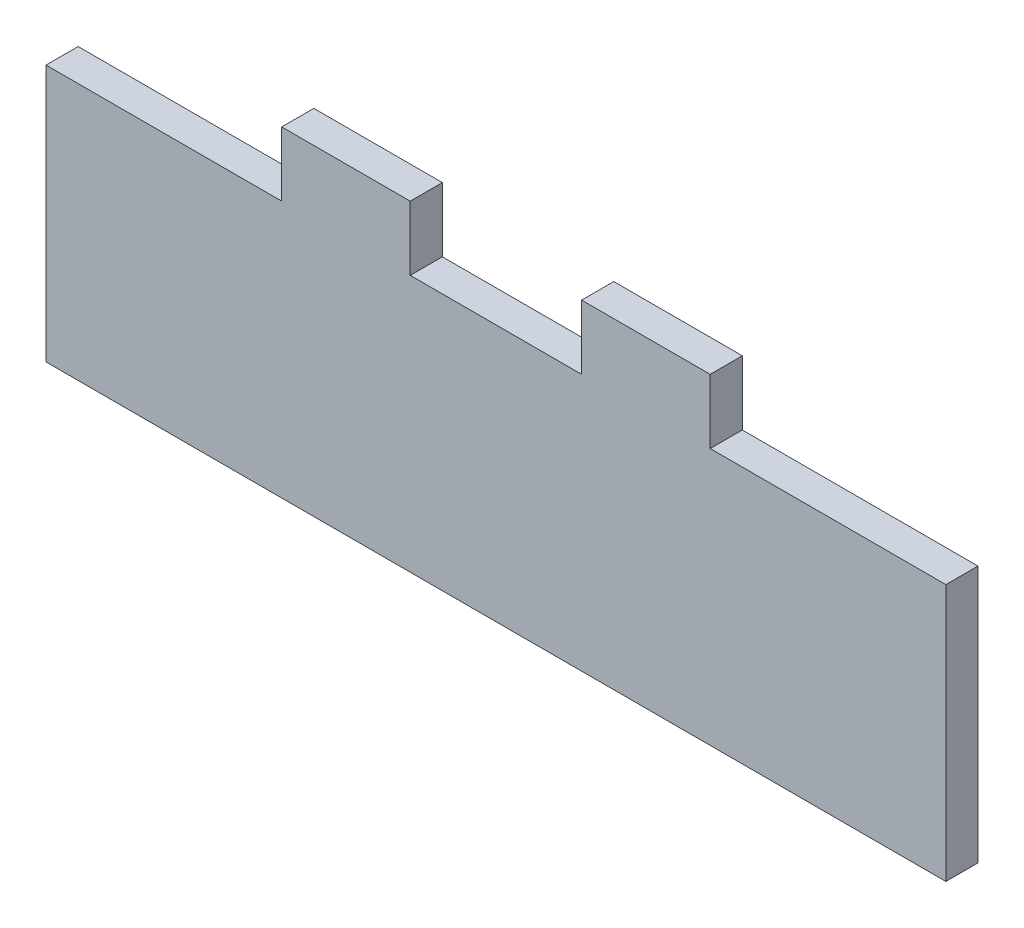
ISO-10303-21;
HEADER;
FILE_DESCRIPTION(('STEP AP214'),'2;1');
FILE_NAME('part.step','',(''),(''),'','','');
FILE_SCHEMA(('AUTOMOTIVE_DESIGN { 1 0 10303 214 1 1 1 1 }'));
ENDSEC;
DATA;
#1=APPLICATION_CONTEXT('core data for automotive mechanical design processes');
#2=APPLICATION_PROTOCOL_DEFINITION('international standard','automotive_design',2000,#1);
#3=PRODUCT_CONTEXT('',#1,'mechanical');
#4=PRODUCT('Part','Part','',(#3));
#5=PRODUCT_RELATED_PRODUCT_CATEGORY('part','',(#4));
#6=PRODUCT_DEFINITION_FORMATION('','',#4);
#7=PRODUCT_DEFINITION_CONTEXT('part definition',#1,'design');
#8=PRODUCT_DEFINITION('design','',#6,#7);
#9=PRODUCT_DEFINITION_SHAPE('','',#8);
#10=(LENGTH_UNIT() NAMED_UNIT(*) SI_UNIT(.MILLI.,.METRE.));
#11=(NAMED_UNIT(*) PLANE_ANGLE_UNIT() SI_UNIT($,.RADIAN.));
#12=(NAMED_UNIT(*) SI_UNIT($,.STERADIAN.) SOLID_ANGLE_UNIT());
#13=UNCERTAINTY_MEASURE_WITH_UNIT(LENGTH_MEASURE(1.E-05),#10,'distance_accuracy_value','');
#14=(GEOMETRIC_REPRESENTATION_CONTEXT(3) GLOBAL_UNCERTAINTY_ASSIGNED_CONTEXT((#13)) GLOBAL_UNIT_ASSIGNED_CONTEXT((#10,
#11,#12)) REPRESENTATION_CONTEXT('',''));
#15=CARTESIAN_POINT('',(0.,0.,0.));
#16=DIRECTION('',(0.,0.,1.));
#17=DIRECTION('',(1.,0.,0.));
#18=AXIS2_PLACEMENT_3D('',#15,#16,#17);
#19=CARTESIAN_POINT('',(0.,-10.,2.5));
#20=DIRECTION('',(0.,-1.,0.));
#21=DIRECTION('',(1.,0.,0.));
#22=AXIS2_PLACEMENT_3D('',#19,#20,#21);
#23=PLANE('',#22);
#24=DIRECTION('',(-1.,0.,0.));
#25=VECTOR('',#24,1.);
#26=CARTESIAN_POINT('',(0.,-10.,0.));
#27=LINE('',#26,#25);
#28=CARTESIAN_POINT('',(35.,-10.,0.));
#29=VERTEX_POINT('',#28);
#30=CARTESIAN_POINT('',(-35.,-10.,0.));
#31=VERTEX_POINT('',#30);
#32=EDGE_CURVE('E303',#29,#31,#27,.T.);
#33=ORIENTED_EDGE('',*,*,#32,.F.);
#34=DIRECTION('',(0.,0.,-1.));
#35=VECTOR('',#34,1.);
#36=CARTESIAN_POINT('',(35.,-10.,2.5));
#37=LINE('',#36,#35);
#38=CARTESIAN_POINT('',(35.,-10.,2.5));
#39=VERTEX_POINT('',#38);
#40=EDGE_CURVE('E147',#39,#29,#37,.T.);
#41=ORIENTED_EDGE('',*,*,#40,.F.);
#42=DIRECTION('',(-1.,0.,0.));
#43=VECTOR('',#42,1.);
#44=CARTESIAN_POINT('',(0.,-10.,2.5));
#45=LINE('',#44,#43);
#46=CARTESIAN_POINT('',(-35.,-10.,2.5));
#47=VERTEX_POINT('',#46);
#48=EDGE_CURVE('E190',#39,#47,#45,.T.);
#49=ORIENTED_EDGE('',*,*,#48,.T.);
#50=DIRECTION('',(0.,0.,-1.));
#51=VECTOR('',#50,1.);
#52=CARTESIAN_POINT('',(-35.,-10.,2.5));
#53=LINE('',#52,#51);
#54=EDGE_CURVE('E200',#47,#31,#53,.T.);
#55=ORIENTED_EDGE('',*,*,#54,.T.);
#56=EDGE_LOOP('',(#33,#41,#49,#55));
#57=FACE_BOUND('',#56,.T.);
#58=ADVANCED_FACE('F92',(#57),#23,.T.);
#59=CARTESIAN_POINT('',(0.,0.,0.));
#60=DIRECTION('',(0.,0.,1.));
#61=DIRECTION('',(1.,0.,0.));
#62=AXIS2_PLACEMENT_3D('',#59,#60,#61);
#63=PLANE('',#62);
#64=DIRECTION('',(-1.,0.,0.));
#65=VECTOR('',#64,1.);
#66=CARTESIAN_POINT('',(0.,10.,0.));
#67=LINE('',#66,#65);
#68=CARTESIAN_POINT('',(-16.6666666666667,10.,0.));
#69=VERTEX_POINT('',#68);
#70=CARTESIAN_POINT('',(-35.,9.99999999999999,0.));
#71=VERTEX_POINT('',#70);
#72=EDGE_CURVE('E308',#69,#71,#67,.T.);
#73=ORIENTED_EDGE('',*,*,#72,.F.);
#74=DIRECTION('',(0.,1.,0.));
#75=VECTOR('',#74,1.);
#76=CARTESIAN_POINT('',(-16.6666666666667,0.,0.));
#77=LINE('',#76,#75);
#78=CARTESIAN_POINT('',(-16.6666666666667,15.,0.));
#79=VERTEX_POINT('',#78);
#80=EDGE_CURVE('E309',#69,#79,#77,.T.);
#81=ORIENTED_EDGE('',*,*,#80,.T.);
#82=DIRECTION('',(1.,0.,0.));
#83=VECTOR('',#82,1.);
#84=CARTESIAN_POINT('',(0.,15.,0.));
#85=LINE('',#84,#83);
#86=CARTESIAN_POINT('',(-6.66666666666666,15.,0.));
#87=VERTEX_POINT('',#86);
#88=EDGE_CURVE('E313',#79,#87,#85,.T.);
#89=ORIENTED_EDGE('',*,*,#88,.T.);
#90=DIRECTION('',(0.,1.,0.));
#91=VECTOR('',#90,1.);
#92=CARTESIAN_POINT('',(-6.66666666666666,0.,0.));
#93=LINE('',#92,#91);
#94=CARTESIAN_POINT('',(-6.66666666666666,10.,0.));
#95=VERTEX_POINT('',#94);
#96=EDGE_CURVE('E317',#95,#87,#93,.T.);
#97=ORIENTED_EDGE('',*,*,#96,.F.);
#98=CARTESIAN_POINT('',(6.66666666666667,10.,0.));
#99=VERTEX_POINT('',#98);
#100=EDGE_CURVE('E321',#99,#95,#67,.T.);
#101=ORIENTED_EDGE('',*,*,#100,.F.);
#102=DIRECTION('',(0.,1.,0.));
#103=VECTOR('',#102,1.);
#104=CARTESIAN_POINT('',(6.66666666666667,0.,0.));
#105=LINE('',#104,#103);
#106=CARTESIAN_POINT('',(6.66666666666667,15.,0.));
#107=VERTEX_POINT('',#106);
#108=EDGE_CURVE('E322',#99,#107,#105,.T.);
#109=ORIENTED_EDGE('',*,*,#108,.T.);
#110=DIRECTION('',(1.,0.,0.));
#111=VECTOR('',#110,1.);
#112=CARTESIAN_POINT('',(0.,15.,0.));
#113=LINE('',#112,#111);
#114=CARTESIAN_POINT('',(16.6666666666667,15.,0.));
#115=VERTEX_POINT('',#114);
#116=EDGE_CURVE('E326',#107,#115,#113,.T.);
#117=ORIENTED_EDGE('',*,*,#116,.T.);
#118=DIRECTION('',(0.,1.,0.));
#119=VECTOR('',#118,1.);
#120=CARTESIAN_POINT('',(16.6666666666667,0.,0.));
#121=LINE('',#120,#119);
#122=CARTESIAN_POINT('',(16.6666666666667,10.,0.));
#123=VERTEX_POINT('',#122);
#124=EDGE_CURVE('E271',#123,#115,#121,.T.);
#125=ORIENTED_EDGE('',*,*,#124,.F.);
#126=CARTESIAN_POINT('',(35.,10.,0.));
#127=VERTEX_POINT('',#126);
#128=EDGE_CURVE('E330',#127,#123,#67,.T.);
#129=ORIENTED_EDGE('',*,*,#128,.F.);
#130=DIRECTION('',(0.,-1.,0.));
#131=VECTOR('',#130,1.);
#132=CARTESIAN_POINT('',(35.,0.,0.));
#133=LINE('',#132,#131);
#134=EDGE_CURVE('E232',#127,#29,#133,.T.);
#135=ORIENTED_EDGE('',*,*,#134,.T.);
#136=ORIENTED_EDGE('',*,*,#32,.T.);
#137=DIRECTION('',(0.,-1.,0.));
#138=VECTOR('',#137,1.);
#139=CARTESIAN_POINT('',(-35.,0.,0.));
#140=LINE('',#139,#138);
#141=EDGE_CURVE('E203',#71,#31,#140,.T.);
#142=ORIENTED_EDGE('',*,*,#141,.F.);
#143=EDGE_LOOP('',(#73,#81,#89,#97,#101,#109,#117,#125,#129,#135,#136,#142));
#144=FACE_BOUND('',#143,.T.);
#145=ADVANCED_FACE('F343',(#144),#63,.F.);
#146=CARTESIAN_POINT('',(-35.,0.,2.5));
#147=DIRECTION('',(1.,0.,0.));
#148=DIRECTION('',(0.,0.,-1.));
#149=AXIS2_PLACEMENT_3D('',#146,#147,#148);
#150=PLANE('',#149);
#151=ORIENTED_EDGE('',*,*,#141,.T.);
#152=ORIENTED_EDGE('',*,*,#54,.F.);
#153=DIRECTION('',(0.,-1.,0.));
#154=VECTOR('',#153,1.);
#155=CARTESIAN_POINT('',(-35.,0.,2.5));
#156=LINE('',#155,#154);
#157=CARTESIAN_POINT('',(-35.,9.99999999999999,2.5));
#158=VERTEX_POINT('',#157);
#159=EDGE_CURVE('E184',#158,#47,#156,.T.);
#160=ORIENTED_EDGE('',*,*,#159,.F.);
#161=DIRECTION('',(0.,0.,-1.));
#162=VECTOR('',#161,1.);
#163=CARTESIAN_POINT('',(-35.,9.99999999999999,2.5));
#164=LINE('',#163,#162);
#165=EDGE_CURVE('E207',#158,#71,#164,.T.);
#166=ORIENTED_EDGE('',*,*,#165,.T.);
#167=EDGE_LOOP('',(#151,#152,#160,#166));
#168=FACE_BOUND('',#167,.T.);
#169=ADVANCED_FACE('F201',(#168),#150,.F.);
#170=CARTESIAN_POINT('',(0.,10.,2.5));
#171=DIRECTION('',(0.,-1.,0.));
#172=DIRECTION('',(1.,0.,0.));
#173=AXIS2_PLACEMENT_3D('',#170,#171,#172);
#174=PLANE('',#173);
#175=ORIENTED_EDGE('',*,*,#128,.T.);
#176=DIRECTION('',(0.,0.,-1.));
#177=VECTOR('',#176,1.);
#178=CARTESIAN_POINT('',(16.6666666666667,10.,2.5));
#179=LINE('',#178,#177);
#180=CARTESIAN_POINT('',(16.6666666666667,10.,2.5));
#181=VERTEX_POINT('',#180);
#182=EDGE_CURVE('E13',#181,#123,#179,.T.);
#183=ORIENTED_EDGE('',*,*,#182,.F.);
#184=DIRECTION('',(-1.,0.,0.));
#185=VECTOR('',#184,1.);
#186=CARTESIAN_POINT('',(0.,10.,2.5));
#187=LINE('',#186,#185);
#188=CARTESIAN_POINT('',(35.,10.,2.5));
#189=VERTEX_POINT('',#188);
#190=EDGE_CURVE('E227',#189,#181,#187,.T.);
#191=ORIENTED_EDGE('',*,*,#190,.F.);
#192=DIRECTION('',(0.,0.,-1.));
#193=VECTOR('',#192,1.);
#194=CARTESIAN_POINT('',(35.,10.,2.5));
#195=LINE('',#194,#193);
#196=EDGE_CURVE('E110',#189,#127,#195,.T.);
#197=ORIENTED_EDGE('',*,*,#196,.T.);
#198=EDGE_LOOP('',(#175,#183,#191,#197));
#199=FACE_BOUND('',#198,.T.);
#200=ADVANCED_FACE('F361',(#199),#174,.F.);
#201=ORIENTED_EDGE('',*,*,#100,.T.);
#202=DIRECTION('',(0.,0.,-1.));
#203=VECTOR('',#202,1.);
#204=CARTESIAN_POINT('',(-6.66666666666666,10.,2.5));
#205=LINE('',#204,#203);
#206=CARTESIAN_POINT('',(-6.66666666666666,10.,2.5));
#207=VERTEX_POINT('',#206);
#208=EDGE_CURVE('E282',#207,#95,#205,.T.);
#209=ORIENTED_EDGE('',*,*,#208,.F.);
#210=CARTESIAN_POINT('',(6.66666666666667,10.,2.5));
#211=VERTEX_POINT('',#210);
#212=EDGE_CURVE('E233',#211,#207,#187,.T.);
#213=ORIENTED_EDGE('',*,*,#212,.F.);
#214=DIRECTION('',(0.,0.,-1.));
#215=VECTOR('',#214,1.);
#216=CARTESIAN_POINT('',(6.66666666666667,10.,2.5));
#217=LINE('',#216,#215);
#218=EDGE_CURVE('E277',#211,#99,#217,.T.);
#219=ORIENTED_EDGE('',*,*,#218,.T.);
#220=EDGE_LOOP('',(#201,#209,#213,#219));
#221=FACE_BOUND('',#220,.T.);
#222=ADVANCED_FACE('F338',(#221),#174,.F.);
#223=ORIENTED_EDGE('',*,*,#72,.T.);
#224=ORIENTED_EDGE('',*,*,#165,.F.);
#225=CARTESIAN_POINT('',(-16.6666666666667,10.,2.5));
#226=VERTEX_POINT('',#225);
#227=EDGE_CURVE('E193',#226,#158,#187,.T.);
#228=ORIENTED_EDGE('',*,*,#227,.F.);
#229=DIRECTION('',(0.,0.,-1.));
#230=VECTOR('',#229,1.);
#231=CARTESIAN_POINT('',(-16.6666666666667,10.,2.5));
#232=LINE('',#231,#230);
#233=EDGE_CURVE('E291',#226,#69,#232,.T.);
#234=ORIENTED_EDGE('',*,*,#233,.T.);
#235=EDGE_LOOP('',(#223,#224,#228,#234));
#236=FACE_BOUND('',#235,.T.);
#237=ADVANCED_FACE('F374',(#236),#174,.F.);
#238=CARTESIAN_POINT('',(35.,0.,2.5));
#239=DIRECTION('',(1.,0.,0.));
#240=DIRECTION('',(0.,0.,-1.));
#241=AXIS2_PLACEMENT_3D('',#238,#239,#240);
#242=PLANE('',#241);
#243=ORIENTED_EDGE('',*,*,#134,.F.);
#244=ORIENTED_EDGE('',*,*,#196,.F.);
#245=DIRECTION('',(0.,-1.,0.));
#246=VECTOR('',#245,1.);
#247=CARTESIAN_POINT('',(35.,0.,2.5));
#248=LINE('',#247,#246);
#249=EDGE_CURVE('E210',#189,#39,#248,.T.);
#250=ORIENTED_EDGE('',*,*,#249,.T.);
#251=ORIENTED_EDGE('',*,*,#40,.T.);
#252=EDGE_LOOP('',(#243,#244,#250,#251));
#253=FACE_BOUND('',#252,.T.);
#254=ADVANCED_FACE('F372',(#253),#242,.T.);
#255=CARTESIAN_POINT('',(0.,0.,2.5));
#256=DIRECTION('',(0.,0.,1.));
#257=DIRECTION('',(1.,0.,0.));
#258=AXIS2_PLACEMENT_3D('',#255,#256,#257);
#259=PLANE('',#258);
#260=ORIENTED_EDGE('',*,*,#212,.T.);
#261=DIRECTION('',(0.,1.,0.));
#262=VECTOR('',#261,1.);
#263=CARTESIAN_POINT('',(-6.66666666666666,0.,2.5));
#264=LINE('',#263,#262);
#265=CARTESIAN_POINT('',(-6.66666666666666,15.,2.5));
#266=VERTEX_POINT('',#265);
#267=EDGE_CURVE('E252',#207,#266,#264,.T.);
#268=ORIENTED_EDGE('',*,*,#267,.T.);
#269=DIRECTION('',(1.,0.,0.));
#270=VECTOR('',#269,1.);
#271=CARTESIAN_POINT('',(0.,15.,2.5));
#272=LINE('',#271,#270);
#273=CARTESIAN_POINT('',(-16.6666666666667,15.,2.5));
#274=VERTEX_POINT('',#273);
#275=EDGE_CURVE('E247',#274,#266,#272,.T.);
#276=ORIENTED_EDGE('',*,*,#275,.F.);
#277=DIRECTION('',(0.,1.,0.));
#278=VECTOR('',#277,1.);
#279=CARTESIAN_POINT('',(-16.6666666666667,0.,2.5));
#280=LINE('',#279,#278);
#281=EDGE_CURVE('E243',#226,#274,#280,.T.);
#282=ORIENTED_EDGE('',*,*,#281,.F.);
#283=ORIENTED_EDGE('',*,*,#227,.T.);
#284=ORIENTED_EDGE('',*,*,#159,.T.);
#285=ORIENTED_EDGE('',*,*,#48,.F.);
#286=ORIENTED_EDGE('',*,*,#249,.F.);
#287=ORIENTED_EDGE('',*,*,#190,.T.);
#288=DIRECTION('',(0.,1.,0.));
#289=VECTOR('',#288,1.);
#290=CARTESIAN_POINT('',(16.6666666666667,0.,2.5));
#291=LINE('',#290,#289);
#292=CARTESIAN_POINT('',(16.6666666666667,15.,2.5));
#293=VERTEX_POINT('',#292);
#294=EDGE_CURVE('E231',#181,#293,#291,.T.);
#295=ORIENTED_EDGE('',*,*,#294,.T.);
#296=DIRECTION('',(1.,0.,0.));
#297=VECTOR('',#296,1.);
#298=CARTESIAN_POINT('',(0.,15.,2.5));
#299=LINE('',#298,#297);
#300=CARTESIAN_POINT('',(6.66666666666667,15.,2.5));
#301=VERTEX_POINT('',#300);
#302=EDGE_CURVE('E259',#301,#293,#299,.T.);
#303=ORIENTED_EDGE('',*,*,#302,.F.);
#304=DIRECTION('',(0.,1.,0.));
#305=VECTOR('',#304,1.);
#306=CARTESIAN_POINT('',(6.66666666666667,0.,2.5));
#307=LINE('',#306,#305);
#308=EDGE_CURVE('E255',#211,#301,#307,.T.);
#309=ORIENTED_EDGE('',*,*,#308,.F.);
#310=EDGE_LOOP('',(#260,#268,#276,#282,#283,#284,#285,#286,#287,#295,#303,#309));
#311=FACE_BOUND('',#310,.T.);
#312=ADVANCED_FACE('F187',(#311),#259,.T.);
#313=CARTESIAN_POINT('',(16.6666666666667,0.,2.5));
#314=DIRECTION('',(-1.,0.,0.));
#315=DIRECTION('',(0.,0.,1.));
#316=AXIS2_PLACEMENT_3D('',#313,#314,#315);
#317=PLANE('',#316);
#318=ORIENTED_EDGE('',*,*,#124,.T.);
#319=DIRECTION('',(0.,0.,-1.));
#320=VECTOR('',#319,1.);
#321=CARTESIAN_POINT('',(16.6666666666667,15.,2.5));
#322=LINE('',#321,#320);
#323=EDGE_CURVE('E102',#293,#115,#322,.T.);
#324=ORIENTED_EDGE('',*,*,#323,.F.);
#325=ORIENTED_EDGE('',*,*,#294,.F.);
#326=ORIENTED_EDGE('',*,*,#182,.T.);
#327=EDGE_LOOP('',(#318,#324,#325,#326));
#328=FACE_BOUND('',#327,.T.);
#329=ADVANCED_FACE('F94',(#328),#317,.F.);
#330=CARTESIAN_POINT('',(0.,15.,2.5));
#331=DIRECTION('',(0.,1.,0.));
#332=DIRECTION('',(0.,0.,1.));
#333=AXIS2_PLACEMENT_3D('',#330,#331,#332);
#334=PLANE('',#333);
#335=ORIENTED_EDGE('',*,*,#116,.F.);
#336=DIRECTION('',(0.,0.,-1.));
#337=VECTOR('',#336,1.);
#338=CARTESIAN_POINT('',(6.66666666666667,15.,2.5));
#339=LINE('',#338,#337);
#340=EDGE_CURVE('E275',#301,#107,#339,.T.);
#341=ORIENTED_EDGE('',*,*,#340,.F.);
#342=ORIENTED_EDGE('',*,*,#302,.T.);
#343=ORIENTED_EDGE('',*,*,#323,.T.);
#344=EDGE_LOOP('',(#335,#341,#342,#343));
#345=FACE_BOUND('',#344,.T.);
#346=ADVANCED_FACE('F354',(#345),#334,.T.);
#347=CARTESIAN_POINT('',(6.66666666666667,0.,2.5));
#348=DIRECTION('',(-1.,0.,0.));
#349=DIRECTION('',(0.,0.,1.));
#350=AXIS2_PLACEMENT_3D('',#347,#348,#349);
#351=PLANE('',#350);
#352=ORIENTED_EDGE('',*,*,#108,.F.);
#353=ORIENTED_EDGE('',*,*,#218,.F.);
#354=ORIENTED_EDGE('',*,*,#308,.T.);
#355=ORIENTED_EDGE('',*,*,#340,.T.);
#356=EDGE_LOOP('',(#352,#353,#354,#355));
#357=FACE_BOUND('',#356,.T.);
#358=ADVANCED_FACE('F353',(#357),#351,.T.);
#359=CARTESIAN_POINT('',(-6.66666666666666,0.,2.5));
#360=DIRECTION('',(-1.,0.,0.));
#361=DIRECTION('',(0.,0.,1.));
#362=AXIS2_PLACEMENT_3D('',#359,#360,#361);
#363=PLANE('',#362);
#364=ORIENTED_EDGE('',*,*,#96,.T.);
#365=DIRECTION('',(0.,0.,-1.));
#366=VECTOR('',#365,1.);
#367=CARTESIAN_POINT('',(-6.66666666666666,15.,2.5));
#368=LINE('',#367,#366);
#369=EDGE_CURVE('E285',#266,#87,#368,.T.);
#370=ORIENTED_EDGE('',*,*,#369,.F.);
#371=ORIENTED_EDGE('',*,*,#267,.F.);
#372=ORIENTED_EDGE('',*,*,#208,.T.);
#373=EDGE_LOOP('',(#364,#370,#371,#372));
#374=FACE_BOUND('',#373,.T.);
#375=ADVANCED_FACE('F347',(#374),#363,.F.);
#376=CARTESIAN_POINT('',(0.,15.,2.5));
#377=DIRECTION('',(0.,1.,0.));
#378=DIRECTION('',(0.,0.,1.));
#379=AXIS2_PLACEMENT_3D('',#376,#377,#378);
#380=PLANE('',#379);
#381=ORIENTED_EDGE('',*,*,#88,.F.);
#382=DIRECTION('',(0.,0.,-1.));
#383=VECTOR('',#382,1.);
#384=CARTESIAN_POINT('',(-16.6666666666667,15.,2.5));
#385=LINE('',#384,#383);
#386=EDGE_CURVE('E288',#274,#79,#385,.T.);
#387=ORIENTED_EDGE('',*,*,#386,.F.);
#388=ORIENTED_EDGE('',*,*,#275,.T.);
#389=ORIENTED_EDGE('',*,*,#369,.T.);
#390=EDGE_LOOP('',(#381,#387,#388,#389));
#391=FACE_BOUND('',#390,.T.);
#392=ADVANCED_FACE('F382',(#391),#380,.T.);
#393=CARTESIAN_POINT('',(-16.6666666666667,0.,2.5));
#394=DIRECTION('',(-1.,0.,0.));
#395=DIRECTION('',(0.,0.,1.));
#396=AXIS2_PLACEMENT_3D('',#393,#394,#395);
#397=PLANE('',#396);
#398=ORIENTED_EDGE('',*,*,#80,.F.);
#399=ORIENTED_EDGE('',*,*,#233,.F.);
#400=ORIENTED_EDGE('',*,*,#281,.T.);
#401=ORIENTED_EDGE('',*,*,#386,.T.);
#402=EDGE_LOOP('',(#398,#399,#400,#401));
#403=FACE_BOUND('',#402,.T.);
#404=ADVANCED_FACE('F379',(#403),#397,.T.);
#405=CLOSED_SHELL('',(#58,#145,#169,#200,#222,#237,#254,#312,#329,#346,#358,#375,#392,#404));
#406=MANIFOLD_SOLID_BREP('B2',#405);
#407=ADVANCED_BREP_SHAPE_REPRESENTATION('',(#18,#406),#14);
#408=SHAPE_DEFINITION_REPRESENTATION(#9,#407);
ENDSEC;
END-ISO-10303-21;
